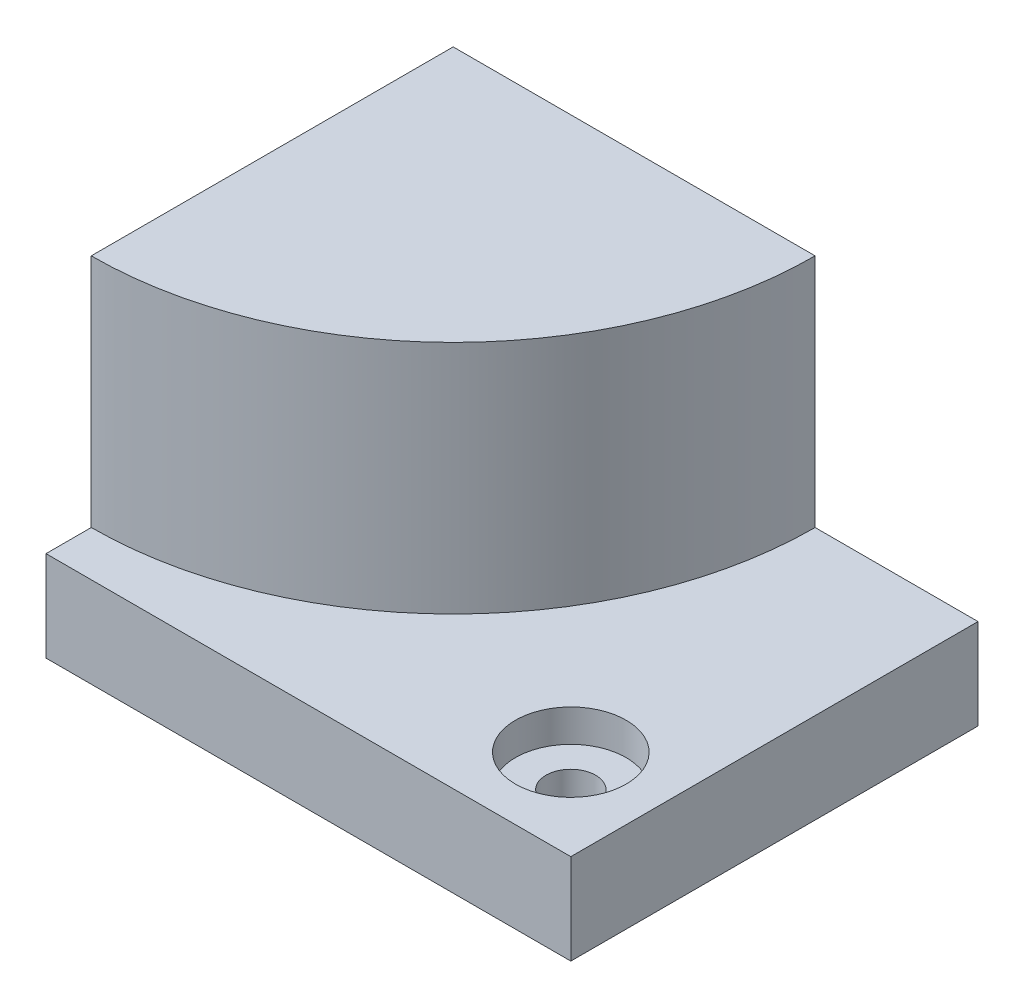
ISO-10303-21;
HEADER;
FILE_DESCRIPTION(('STEP AP214'),'2;1');
FILE_NAME('part.step','',(''),(''),'','','');
FILE_SCHEMA(('AUTOMOTIVE_DESIGN { 1 0 10303 214 1 1 1 1 }'));
ENDSEC;
DATA;
#1=APPLICATION_CONTEXT('core data for automotive mechanical design processes');
#2=APPLICATION_PROTOCOL_DEFINITION('international standard','automotive_design',2000,#1);
#3=PRODUCT_CONTEXT('',#1,'mechanical');
#4=PRODUCT('Part','Part','',(#3));
#5=PRODUCT_RELATED_PRODUCT_CATEGORY('part','',(#4));
#6=PRODUCT_DEFINITION_FORMATION('','',#4);
#7=PRODUCT_DEFINITION_CONTEXT('part definition',#1,'design');
#8=PRODUCT_DEFINITION('design','',#6,#7);
#9=PRODUCT_DEFINITION_SHAPE('','',#8);
#10=(LENGTH_UNIT() NAMED_UNIT(*) SI_UNIT(.MILLI.,.METRE.));
#11=(NAMED_UNIT(*) PLANE_ANGLE_UNIT() SI_UNIT($,.RADIAN.));
#12=(NAMED_UNIT(*) SI_UNIT($,.STERADIAN.) SOLID_ANGLE_UNIT());
#13=UNCERTAINTY_MEASURE_WITH_UNIT(LENGTH_MEASURE(1.E-05),#10,'distance_accuracy_value','');
#14=(GEOMETRIC_REPRESENTATION_CONTEXT(3) GLOBAL_UNCERTAINTY_ASSIGNED_CONTEXT((#13)) GLOBAL_UNIT_ASSIGNED_CONTEXT((#10,
#11,#12)) REPRESENTATION_CONTEXT('',''));
#15=CARTESIAN_POINT('',(0.,0.,0.));
#16=DIRECTION('',(0.,0.,1.));
#17=DIRECTION('',(1.,0.,0.));
#18=AXIS2_PLACEMENT_3D('',#15,#16,#17);
#19=CARTESIAN_POINT('',(0.,10.,0.));
#20=DIRECTION('',(0.,-1.,0.));
#21=DIRECTION('',(0.,0.,-1.));
#22=AXIS2_PLACEMENT_3D('',#19,#20,#21);
#23=PLANE('',#22);
#24=CARTESIAN_POINT('',(19.,10.,12.5));
#25=DIRECTION('',(0.,1.,0.));
#26=DIRECTION('',(0.,0.,1.));
#27=AXIS2_PLACEMENT_3D('',#24,#25,#26);
#28=CIRCLE('',#27,6.12);
#29=CARTESIAN_POINT('',(19.,10.,18.62));
#30=VERTEX_POINT('',#29);
#31=EDGE_CURVE('E157',#30,#30,#28,.T.);
#32=ORIENTED_EDGE('',*,*,#31,.F.);
#33=EDGE_LOOP('',(#32));
#34=FACE_BOUND('',#33,.T.);
#35=CARTESIAN_POINT('',(-29.,10.,-22.5));
#36=DIRECTION('',(0.,1.,0.));
#37=DIRECTION('',(0.,0.,1.));
#38=AXIS2_PLACEMENT_3D('',#35,#36,#37);
#39=CIRCLE('',#38,40.);
#40=CARTESIAN_POINT('',(-29.,10.,17.5));
#41=VERTEX_POINT('',#40);
#42=CARTESIAN_POINT('',(11.,10.,-22.5));
#43=VERTEX_POINT('',#42);
#44=EDGE_CURVE('E54',#41,#43,#39,.T.);
#45=ORIENTED_EDGE('',*,*,#44,.F.);
#46=DIRECTION('',(0.,0.,1.));
#47=VECTOR('',#46,1.);
#48=CARTESIAN_POINT('',(-29.,10.,22.5));
#49=LINE('',#48,#47);
#50=CARTESIAN_POINT('',(-29.,10.,22.5));
#51=VERTEX_POINT('',#50);
#52=EDGE_CURVE('E117',#41,#51,#49,.T.);
#53=ORIENTED_EDGE('',*,*,#52,.T.);
#54=DIRECTION('',(1.,0.,0.));
#55=VECTOR('',#54,1.);
#56=CARTESIAN_POINT('',(-29.,10.,22.5));
#57=LINE('',#56,#55);
#58=CARTESIAN_POINT('',(29.,10.,22.5));
#59=VERTEX_POINT('',#58);
#60=EDGE_CURVE('E179',#51,#59,#57,.T.);
#61=ORIENTED_EDGE('',*,*,#60,.T.);
#62=DIRECTION('',(0.,0.,-1.));
#63=VECTOR('',#62,1.);
#64=CARTESIAN_POINT('',(29.,10.,22.5));
#65=LINE('',#64,#63);
#66=CARTESIAN_POINT('',(29.,10.,-22.5));
#67=VERTEX_POINT('',#66);
#68=EDGE_CURVE('E170',#59,#67,#65,.T.);
#69=ORIENTED_EDGE('',*,*,#68,.T.);
#70=DIRECTION('',(-1.,0.,0.));
#71=VECTOR('',#70,1.);
#72=CARTESIAN_POINT('',(-29.,10.,-22.5));
#73=LINE('',#72,#71);
#74=EDGE_CURVE('E175',#67,#43,#73,.T.);
#75=ORIENTED_EDGE('',*,*,#74,.T.);
#76=EDGE_LOOP('',(#45,#53,#61,#69,#75));
#77=FACE_BOUND('',#76,.T.);
#78=ADVANCED_FACE('F39',(#34,#77),#23,.F.);
#79=CARTESIAN_POINT('',(-14.,10.,-7.5));
#80=DIRECTION('',(0.,1.,0.));
#81=DIRECTION('',(0.,0.,1.));
#82=AXIS2_PLACEMENT_3D('',#79,#80,#81);
#83=CIRCLE('',#82,2.);
#84=CARTESIAN_POINT('',(-14.,10.,-5.5));
#85=VERTEX_POINT('',#84);
#86=EDGE_CURVE('E138',#85,#85,#83,.T.);
#87=ORIENTED_EDGE('',*,*,#86,.F.);
#88=EDGE_LOOP('',(#87));
#89=FACE_BOUND('',#88,.T.);
#90=CARTESIAN_POINT('',(-29.,10.,-22.5));
#91=DIRECTION('',(0.,-1.,0.));
#92=DIRECTION('',(0.,0.,1.));
#93=AXIS2_PLACEMENT_3D('',#90,#91,#92);
#94=CIRCLE('',#93,30.);
#95=CARTESIAN_POINT('',(1.,10.,-22.5));
#96=VERTEX_POINT('',#95);
#97=CARTESIAN_POINT('',(-29.,10.,7.5));
#98=VERTEX_POINT('',#97);
#99=EDGE_CURVE('E62',#96,#98,#94,.T.);
#100=ORIENTED_EDGE('',*,*,#99,.F.);
#101=CARTESIAN_POINT('',(-29.,10.,-22.5));
#102=VERTEX_POINT('',#101);
#103=EDGE_CURVE('E173',#96,#102,#73,.T.);
#104=ORIENTED_EDGE('',*,*,#103,.T.);
#105=EDGE_CURVE('E177',#102,#98,#49,.T.);
#106=ORIENTED_EDGE('',*,*,#105,.T.);
#107=EDGE_LOOP('',(#100,#104,#106));
#108=FACE_BOUND('',#107,.T.);
#109=ADVANCED_FACE('F217',(#89,#108),#23,.F.);
#110=CARTESIAN_POINT('',(29.,10.,22.5));
#111=DIRECTION('',(-1.,0.,0.));
#112=DIRECTION('',(0.,0.,1.));
#113=AXIS2_PLACEMENT_3D('',#110,#111,#112);
#114=PLANE('',#113);
#115=DIRECTION('',(0.,0.,-1.));
#116=VECTOR('',#115,1.);
#117=CARTESIAN_POINT('',(29.,0.,22.5));
#118=LINE('',#117,#116);
#119=CARTESIAN_POINT('',(29.,0.,22.5));
#120=VERTEX_POINT('',#119);
#121=CARTESIAN_POINT('',(29.,0.,-22.5));
#122=VERTEX_POINT('',#121);
#123=EDGE_CURVE('E169',#120,#122,#118,.T.);
#124=ORIENTED_EDGE('',*,*,#123,.T.);
#125=DIRECTION('',(0.,-1.,0.));
#126=VECTOR('',#125,1.);
#127=CARTESIAN_POINT('',(29.,10.,-22.5));
#128=LINE('',#127,#126);
#129=EDGE_CURVE('E11',#67,#122,#128,.T.);
#130=ORIENTED_EDGE('',*,*,#129,.F.);
#131=ORIENTED_EDGE('',*,*,#68,.F.);
#132=DIRECTION('',(0.,-1.,0.));
#133=VECTOR('',#132,1.);
#134=CARTESIAN_POINT('',(29.,10.,22.5));
#135=LINE('',#134,#133);
#136=EDGE_CURVE('E181',#59,#120,#135,.T.);
#137=ORIENTED_EDGE('',*,*,#136,.T.);
#138=EDGE_LOOP('',(#124,#130,#131,#137));
#139=FACE_BOUND('',#138,.T.);
#140=ADVANCED_FACE('F41',(#139),#114,.F.);
#141=CARTESIAN_POINT('',(-29.,10.,-22.5));
#142=DIRECTION('',(0.,0.,1.));
#143=DIRECTION('',(1.,0.,0.));
#144=AXIS2_PLACEMENT_3D('',#141,#142,#143);
#145=PLANE('',#144);
#146=DIRECTION('',(-1.,0.,0.));
#147=VECTOR('',#146,1.);
#148=CARTESIAN_POINT('',(-29.,0.,-22.5));
#149=LINE('',#148,#147);
#150=CARTESIAN_POINT('',(-29.,0.,-22.5));
#151=VERTEX_POINT('',#150);
#152=EDGE_CURVE('E184',#122,#151,#149,.T.);
#153=ORIENTED_EDGE('',*,*,#152,.T.);
#154=DIRECTION('',(0.,-1.,0.));
#155=VECTOR('',#154,1.);
#156=CARTESIAN_POINT('',(-29.,10.,-22.5));
#157=LINE('',#156,#155);
#158=EDGE_CURVE('E47',#102,#151,#157,.T.);
#159=ORIENTED_EDGE('',*,*,#158,.F.);
#160=ORIENTED_EDGE('',*,*,#103,.F.);
#161=DIRECTION('',(0.,-1.,0.));
#162=VECTOR('',#161,1.);
#163=CARTESIAN_POINT('',(1.00000000000001,26.,-22.5));
#164=LINE('',#163,#162);
#165=CARTESIAN_POINT('',(1.00000000000001,26.,-22.5));
#166=VERTEX_POINT('',#165);
#167=EDGE_CURVE('E153',#166,#96,#164,.T.);
#168=ORIENTED_EDGE('',*,*,#167,.F.);
#169=DIRECTION('',(-1.,0.,0.));
#170=VECTOR('',#169,1.);
#171=CARTESIAN_POINT('',(11.,26.,-22.5));
#172=LINE('',#171,#170);
#173=CARTESIAN_POINT('',(-29.,26.,-22.5));
#174=VERTEX_POINT('',#173);
#175=EDGE_CURVE('E133',#166,#174,#172,.T.);
#176=ORIENTED_EDGE('',*,*,#175,.T.);
#177=DIRECTION('',(0.,-1.,0.));
#178=VECTOR('',#177,1.);
#179=CARTESIAN_POINT('',(-29.,36.,-22.5));
#180=LINE('',#179,#178);
#181=CARTESIAN_POINT('',(-29.,36.,-22.5));
#182=VERTEX_POINT('',#181);
#183=EDGE_CURVE('E142',#182,#174,#180,.T.);
#184=ORIENTED_EDGE('',*,*,#183,.F.);
#185=DIRECTION('',(-1.,0.,0.));
#186=VECTOR('',#185,1.);
#187=CARTESIAN_POINT('',(11.,36.,-22.5));
#188=LINE('',#187,#186);
#189=CARTESIAN_POINT('',(11.,36.,-22.5));
#190=VERTEX_POINT('',#189);
#191=EDGE_CURVE('E129',#190,#182,#188,.T.);
#192=ORIENTED_EDGE('',*,*,#191,.F.);
#193=DIRECTION('',(0.,-1.,0.));
#194=VECTOR('',#193,1.);
#195=CARTESIAN_POINT('',(11.,26.,-22.5));
#196=LINE('',#195,#194);
#197=EDGE_CURVE('E126',#190,#43,#196,.T.);
#198=ORIENTED_EDGE('',*,*,#197,.T.);
#199=ORIENTED_EDGE('',*,*,#74,.F.);
#200=ORIENTED_EDGE('',*,*,#129,.T.);
#201=EDGE_LOOP('',(#153,#159,#160,#168,#176,#184,#192,#198,#199,#200));
#202=FACE_BOUND('',#201,.T.);
#203=ADVANCED_FACE('F209',(#202),#145,.F.);
#204=CARTESIAN_POINT('',(-29.,10.,22.5));
#205=DIRECTION('',(1.,0.,0.));
#206=DIRECTION('',(0.,0.,-1.));
#207=AXIS2_PLACEMENT_3D('',#204,#205,#206);
#208=PLANE('',#207);
#209=DIRECTION('',(0.,0.,1.));
#210=VECTOR('',#209,1.);
#211=CARTESIAN_POINT('',(-29.,0.,22.5));
#212=LINE('',#211,#210);
#213=CARTESIAN_POINT('',(-29.,0.,22.5));
#214=VERTEX_POINT('',#213);
#215=EDGE_CURVE('E186',#151,#214,#212,.T.);
#216=ORIENTED_EDGE('',*,*,#215,.T.);
#217=DIRECTION('',(0.,-1.,0.));
#218=VECTOR('',#217,1.);
#219=CARTESIAN_POINT('',(-29.,10.,22.5));
#220=LINE('',#219,#218);
#221=EDGE_CURVE('E191',#51,#214,#220,.T.);
#222=ORIENTED_EDGE('',*,*,#221,.F.);
#223=ORIENTED_EDGE('',*,*,#52,.F.);
#224=DIRECTION('',(0.,-1.,0.));
#225=VECTOR('',#224,1.);
#226=CARTESIAN_POINT('',(-29.,26.,17.5));
#227=LINE('',#226,#225);
#228=CARTESIAN_POINT('',(-29.,36.,17.5));
#229=VERTEX_POINT('',#228);
#230=EDGE_CURVE('E110',#229,#41,#227,.T.);
#231=ORIENTED_EDGE('',*,*,#230,.F.);
#232=DIRECTION('',(0.,0.,1.));
#233=VECTOR('',#232,1.);
#234=CARTESIAN_POINT('',(-29.,36.,-22.5));
#235=LINE('',#234,#233);
#236=EDGE_CURVE('E115',#182,#229,#235,.T.);
#237=ORIENTED_EDGE('',*,*,#236,.F.);
#238=ORIENTED_EDGE('',*,*,#183,.T.);
#239=DIRECTION('',(0.,0.,1.));
#240=VECTOR('',#239,1.);
#241=CARTESIAN_POINT('',(-29.,26.,-22.5));
#242=LINE('',#241,#240);
#243=CARTESIAN_POINT('',(-29.,26.,7.5));
#244=VERTEX_POINT('',#243);
#245=EDGE_CURVE('E135',#174,#244,#242,.T.);
#246=ORIENTED_EDGE('',*,*,#245,.T.);
#247=DIRECTION('',(0.,-1.,0.));
#248=VECTOR('',#247,1.);
#249=CARTESIAN_POINT('',(-29.,26.,7.5));
#250=LINE('',#249,#248);
#251=EDGE_CURVE('E119',#244,#98,#250,.T.);
#252=ORIENTED_EDGE('',*,*,#251,.T.);
#253=ORIENTED_EDGE('',*,*,#105,.F.);
#254=ORIENTED_EDGE('',*,*,#158,.T.);
#255=EDGE_LOOP('',(#216,#222,#223,#231,#237,#238,#246,#252,#253,#254));
#256=FACE_BOUND('',#255,.T.);
#257=ADVANCED_FACE('F112',(#256),#208,.F.);
#258=CARTESIAN_POINT('',(-29.,10.,22.5));
#259=DIRECTION('',(0.,0.,-1.));
#260=DIRECTION('',(-1.,0.,0.));
#261=AXIS2_PLACEMENT_3D('',#258,#259,#260);
#262=PLANE('',#261);
#263=DIRECTION('',(1.,0.,0.));
#264=VECTOR('',#263,1.);
#265=CARTESIAN_POINT('',(-29.,0.,22.5));
#266=LINE('',#265,#264);
#267=EDGE_CURVE('E174',#214,#120,#266,.T.);
#268=ORIENTED_EDGE('',*,*,#267,.T.);
#269=ORIENTED_EDGE('',*,*,#136,.F.);
#270=ORIENTED_EDGE('',*,*,#60,.F.);
#271=ORIENTED_EDGE('',*,*,#221,.T.);
#272=EDGE_LOOP('',(#268,#269,#270,#271));
#273=FACE_BOUND('',#272,.T.);
#274=ADVANCED_FACE('F204',(#273),#262,.F.);
#275=CARTESIAN_POINT('',(0.,0.,0.));
#276=DIRECTION('',(0.,-1.,0.));
#277=DIRECTION('',(0.,0.,-1.));
#278=AXIS2_PLACEMENT_3D('',#275,#276,#277);
#279=PLANE('',#278);
#280=CARTESIAN_POINT('',(19.,0.,12.5));
#281=DIRECTION('',(0.,1.,0.));
#282=DIRECTION('',(0.,0.,1.));
#283=AXIS2_PLACEMENT_3D('',#280,#281,#282);
#284=CIRCLE('',#283,2.75);
#285=CARTESIAN_POINT('',(19.,0.,15.25));
#286=VERTEX_POINT('',#285);
#287=EDGE_CURVE('E166',#286,#286,#284,.T.);
#288=ORIENTED_EDGE('',*,*,#287,.T.);
#289=EDGE_LOOP('',(#288));
#290=FACE_BOUND('',#289,.T.);
#291=ORIENTED_EDGE('',*,*,#123,.F.);
#292=ORIENTED_EDGE('',*,*,#267,.F.);
#293=ORIENTED_EDGE('',*,*,#215,.F.);
#294=ORIENTED_EDGE('',*,*,#152,.F.);
#295=EDGE_LOOP('',(#291,#292,#293,#294));
#296=FACE_BOUND('',#295,.T.);
#297=ADVANCED_FACE('F201',(#290,#296),#279,.T.);
#298=CARTESIAN_POINT('',(19.,10.,12.5));
#299=DIRECTION('',(0.,1.,0.));
#300=DIRECTION('',(0.,0.,1.));
#301=AXIS2_PLACEMENT_3D('',#298,#299,#300);
#302=CYLINDRICAL_SURFACE('',#301,2.75);
#303=ORIENTED_EDGE('',*,*,#287,.F.);
#304=EDGE_LOOP('',(#303));
#305=FACE_BOUND('',#304,.T.);
#306=CARTESIAN_POINT('',(19.,6.42,12.5));
#307=DIRECTION('',(0.,1.,0.));
#308=DIRECTION('',(0.,0.,1.));
#309=AXIS2_PLACEMENT_3D('',#306,#307,#308);
#310=CIRCLE('',#309,2.75);
#311=CARTESIAN_POINT('',(19.,6.42,15.25));
#312=VERTEX_POINT('',#311);
#313=EDGE_CURVE('E163',#312,#312,#310,.T.);
#314=ORIENTED_EDGE('',*,*,#313,.T.);
#315=EDGE_LOOP('',(#314));
#316=FACE_BOUND('',#315,.T.);
#317=ADVANCED_FACE('F229',(#305,#316),#302,.F.);
#318=CARTESIAN_POINT('',(21.75,6.42,12.5));
#319=DIRECTION('',(0.,-1.,0.));
#320=DIRECTION('',(0.,0.,-1.));
#321=AXIS2_PLACEMENT_3D('',#318,#319,#320);
#322=PLANE('',#321);
#323=ORIENTED_EDGE('',*,*,#313,.F.);
#324=EDGE_LOOP('',(#323));
#325=FACE_BOUND('',#324,.T.);
#326=CARTESIAN_POINT('',(19.,6.42,12.5));
#327=DIRECTION('',(0.,1.,0.));
#328=DIRECTION('',(0.,0.,1.));
#329=AXIS2_PLACEMENT_3D('',#326,#327,#328);
#330=CIRCLE('',#329,6.12);
#331=CARTESIAN_POINT('',(19.,6.42,18.62));
#332=VERTEX_POINT('',#331);
#333=EDGE_CURVE('E160',#332,#332,#330,.T.);
#334=ORIENTED_EDGE('',*,*,#333,.T.);
#335=EDGE_LOOP('',(#334));
#336=FACE_BOUND('',#335,.T.);
#337=ADVANCED_FACE('F262',(#325,#336),#322,.F.);
#338=CARTESIAN_POINT('',(19.,10.,12.5));
#339=DIRECTION('',(0.,1.,0.));
#340=DIRECTION('',(0.,0.,1.));
#341=AXIS2_PLACEMENT_3D('',#338,#339,#340);
#342=CYLINDRICAL_SURFACE('',#341,6.12);
#343=ORIENTED_EDGE('',*,*,#333,.F.);
#344=EDGE_LOOP('',(#343));
#345=FACE_BOUND('',#344,.T.);
#346=ORIENTED_EDGE('',*,*,#31,.T.);
#347=EDGE_LOOP('',(#346));
#348=FACE_BOUND('',#347,.T.);
#349=ADVANCED_FACE('F269',(#345,#348),#342,.F.);
#350=CARTESIAN_POINT('',(-29.,26.,-22.5));
#351=DIRECTION('',(0.,-1.,0.));
#352=DIRECTION('',(0.,0.,-1.));
#353=AXIS2_PLACEMENT_3D('',#350,#351,#352);
#354=CYLINDRICAL_SURFACE('',#353,40.);
#355=ORIENTED_EDGE('',*,*,#44,.T.);
#356=ORIENTED_EDGE('',*,*,#197,.F.);
#357=CARTESIAN_POINT('',(-29.,36.,-22.5));
#358=DIRECTION('',(0.,1.,0.));
#359=DIRECTION('',(0.,0.,1.));
#360=AXIS2_PLACEMENT_3D('',#357,#358,#359);
#361=CIRCLE('',#360,40.);
#362=EDGE_CURVE('E123',#229,#190,#361,.T.);
#363=ORIENTED_EDGE('',*,*,#362,.F.);
#364=ORIENTED_EDGE('',*,*,#230,.T.);
#365=EDGE_LOOP('',(#355,#356,#363,#364));
#366=FACE_BOUND('',#365,.T.);
#367=ADVANCED_FACE('F124',(#366),#354,.T.);
#368=CARTESIAN_POINT('',(-29.,26.,-22.5));
#369=DIRECTION('',(0.,-1.,0.));
#370=DIRECTION('',(0.,0.,-1.));
#371=AXIS2_PLACEMENT_3D('',#368,#369,#370);
#372=CYLINDRICAL_SURFACE('',#371,30.);
#373=ORIENTED_EDGE('',*,*,#99,.T.);
#374=ORIENTED_EDGE('',*,*,#251,.F.);
#375=CARTESIAN_POINT('',(-29.,26.,-22.5));
#376=DIRECTION('',(0.,-1.,0.));
#377=DIRECTION('',(0.,0.,1.));
#378=AXIS2_PLACEMENT_3D('',#375,#376,#377);
#379=CIRCLE('',#378,30.);
#380=EDGE_CURVE('E120',#166,#244,#379,.T.);
#381=ORIENTED_EDGE('',*,*,#380,.F.);
#382=ORIENTED_EDGE('',*,*,#167,.T.);
#383=EDGE_LOOP('',(#373,#374,#381,#382));
#384=FACE_BOUND('',#383,.T.);
#385=ADVANCED_FACE('F216',(#384),#372,.F.);
#386=CARTESIAN_POINT('',(-29.,26.,-22.5));
#387=DIRECTION('',(0.,1.,0.));
#388=DIRECTION('',(0.,0.,1.));
#389=AXIS2_PLACEMENT_3D('',#386,#387,#388);
#390=PLANE('',#389);
#391=ORIENTED_EDGE('',*,*,#175,.F.);
#392=ORIENTED_EDGE('',*,*,#380,.T.);
#393=ORIENTED_EDGE('',*,*,#245,.F.);
#394=EDGE_LOOP('',(#391,#392,#393));
#395=FACE_BOUND('',#394,.T.);
#396=ADVANCED_FACE('F213',(#395),#390,.F.);
#397=CARTESIAN_POINT('',(-29.,36.,-22.5));
#398=DIRECTION('',(0.,1.,0.));
#399=DIRECTION('',(0.,0.,1.));
#400=AXIS2_PLACEMENT_3D('',#397,#398,#399);
#401=PLANE('',#400);
#402=ORIENTED_EDGE('',*,*,#236,.T.);
#403=ORIENTED_EDGE('',*,*,#362,.T.);
#404=ORIENTED_EDGE('',*,*,#191,.T.);
#405=EDGE_LOOP('',(#402,#403,#404));
#406=FACE_BOUND('',#405,.T.);
#407=ADVANCED_FACE('F131',(#406),#401,.T.);
#408=CARTESIAN_POINT('',(-14.,4.,-7.5));
#409=DIRECTION('',(0.,1.,0.));
#410=DIRECTION('',(0.,0.,1.));
#411=AXIS2_PLACEMENT_3D('',#408,#409,#410);
#412=CYLINDRICAL_SURFACE('',#411,2.);
#413=CARTESIAN_POINT('',(-14.,4.,-7.5));
#414=DIRECTION('',(0.,1.,0.));
#415=DIRECTION('',(0.,0.,1.));
#416=AXIS2_PLACEMENT_3D('',#413,#414,#415);
#417=CIRCLE('',#416,2.);
#418=CARTESIAN_POINT('',(-14.,4.,-5.5));
#419=VERTEX_POINT('',#418);
#420=EDGE_CURVE('E144',#419,#419,#417,.T.);
#421=ORIENTED_EDGE('',*,*,#420,.F.);
#422=EDGE_LOOP('',(#421));
#423=FACE_BOUND('',#422,.T.);
#424=ORIENTED_EDGE('',*,*,#86,.T.);
#425=EDGE_LOOP('',(#424));
#426=FACE_BOUND('',#425,.T.);
#427=ADVANCED_FACE('F300',(#423,#426),#412,.F.);
#428=CARTESIAN_POINT('',(-14.,4.,-7.5));
#429=DIRECTION('',(0.,1.,0.));
#430=DIRECTION('',(0.,0.,1.));
#431=AXIS2_PLACEMENT_3D('',#428,#429,#430);
#432=PLANE('',#431);
#433=ORIENTED_EDGE('',*,*,#420,.T.);
#434=EDGE_LOOP('',(#433));
#435=FACE_BOUND('',#434,.T.);
#436=ADVANCED_FACE('F307',(#435),#432,.T.);
#437=CLOSED_SHELL('',(#78,#109,#140,#203,#257,#274,#297,#317,#337,#349,#367,#385,#396,#407,#427,#436));
#438=MANIFOLD_SOLID_BREP('B2',#437);
#439=ADVANCED_BREP_SHAPE_REPRESENTATION('',(#18,#438),#14);
#440=SHAPE_DEFINITION_REPRESENTATION(#9,#439);
ENDSEC;
END-ISO-10303-21;
